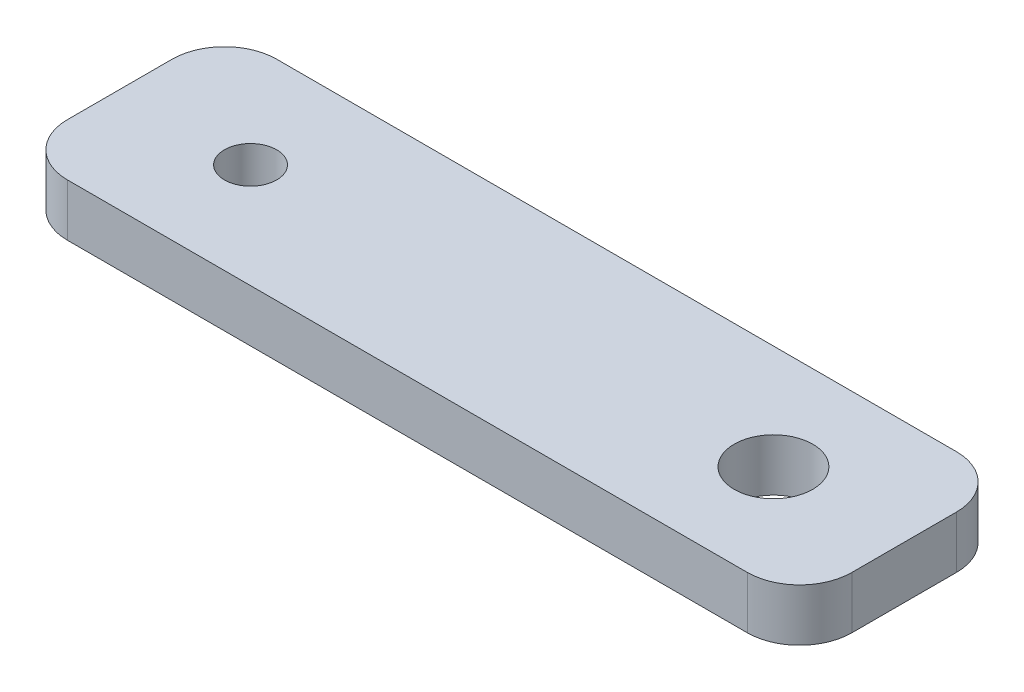
ISO-10303-21;
HEADER;
FILE_DESCRIPTION(('STEP AP214'),'2;1');
FILE_NAME('part.step','',(''),(''),'','','');
FILE_SCHEMA(('AUTOMOTIVE_DESIGN { 1 0 10303 214 1 1 1 1 }'));
ENDSEC;
DATA;
#1=APPLICATION_CONTEXT('core data for automotive mechanical design processes');
#2=APPLICATION_PROTOCOL_DEFINITION('international standard','automotive_design',2000,#1);
#3=PRODUCT_CONTEXT('',#1,'mechanical');
#4=PRODUCT('Part','Part','',(#3));
#5=PRODUCT_RELATED_PRODUCT_CATEGORY('part','',(#4));
#6=PRODUCT_DEFINITION_FORMATION('','',#4);
#7=PRODUCT_DEFINITION_CONTEXT('part definition',#1,'design');
#8=PRODUCT_DEFINITION('design','',#6,#7);
#9=PRODUCT_DEFINITION_SHAPE('','',#8);
#10=(LENGTH_UNIT() NAMED_UNIT(*) SI_UNIT(.MILLI.,.METRE.));
#11=(NAMED_UNIT(*) PLANE_ANGLE_UNIT() SI_UNIT($,.RADIAN.));
#12=(NAMED_UNIT(*) SI_UNIT($,.STERADIAN.) SOLID_ANGLE_UNIT());
#13=UNCERTAINTY_MEASURE_WITH_UNIT(LENGTH_MEASURE(1.E-05),#10,'distance_accuracy_value','');
#14=(GEOMETRIC_REPRESENTATION_CONTEXT(3) GLOBAL_UNCERTAINTY_ASSIGNED_CONTEXT((#13)) GLOBAL_UNIT_ASSIGNED_CONTEXT((#10,
#11,#12)) REPRESENTATION_CONTEXT('',''));
#15=CARTESIAN_POINT('',(0.,0.,0.));
#16=DIRECTION('',(0.,0.,1.));
#17=DIRECTION('',(1.,0.,0.));
#18=AXIS2_PLACEMENT_3D('',#15,#16,#17);
#19=CARTESIAN_POINT('',(0.,2.,0.));
#20=DIRECTION('',(1.,0.,0.));
#21=DIRECTION('',(0.,0.,-1.));
#22=AXIS2_PLACEMENT_3D('',#19,#20,#21);
#23=PLANE('',#22);
#24=DIRECTION('',(0.,0.,1.));
#25=VECTOR('',#24,1.);
#26=CARTESIAN_POINT('',(0.,0.,0.));
#27=LINE('',#26,#25);
#28=CARTESIAN_POINT('',(0.,0.,2.));
#29=VERTEX_POINT('',#28);
#30=CARTESIAN_POINT('',(0.,0.,6.));
#31=VERTEX_POINT('',#30);
#32=EDGE_CURVE('E157',#29,#31,#27,.T.);
#33=ORIENTED_EDGE('',*,*,#32,.T.);
#34=DIRECTION('',(0.,-1.,0.));
#35=VECTOR('',#34,1.);
#36=CARTESIAN_POINT('',(0.,2.,6.));
#37=LINE('',#36,#35);
#38=CARTESIAN_POINT('',(0.,2.,6.));
#39=VERTEX_POINT('',#38);
#40=EDGE_CURVE('E11',#31,#39,#37,.F.);
#41=ORIENTED_EDGE('',*,*,#40,.T.);
#42=DIRECTION('',(0.,0.,1.));
#43=VECTOR('',#42,1.);
#44=CARTESIAN_POINT('',(0.,2.,0.));
#45=LINE('',#44,#43);
#46=CARTESIAN_POINT('',(0.,2.,2.));
#47=VERTEX_POINT('',#46);
#48=EDGE_CURVE('E125',#47,#39,#45,.T.);
#49=ORIENTED_EDGE('',*,*,#48,.F.);
#50=DIRECTION('',(0.,-1.,0.));
#51=VECTOR('',#50,1.);
#52=CARTESIAN_POINT('',(0.,2.,2.));
#53=LINE('',#52,#51);
#54=EDGE_CURVE('E41',#47,#29,#53,.T.);
#55=ORIENTED_EDGE('',*,*,#54,.T.);
#56=EDGE_LOOP('',(#33,#41,#49,#55));
#57=FACE_BOUND('',#56,.T.);
#58=ADVANCED_FACE('F33',(#57),#23,.F.);
#59=CARTESIAN_POINT('',(0.,2.,8.));
#60=DIRECTION('',(0.,0.,-1.));
#61=DIRECTION('',(-1.,0.,0.));
#62=AXIS2_PLACEMENT_3D('',#59,#60,#61);
#63=PLANE('',#62);
#64=DIRECTION('',(1.,0.,0.));
#65=VECTOR('',#64,1.);
#66=CARTESIAN_POINT('',(0.,0.,8.));
#67=LINE('',#66,#65);
#68=CARTESIAN_POINT('',(2.,0.,8.));
#69=VERTEX_POINT('',#68);
#70=CARTESIAN_POINT('',(28.,0.,8.));
#71=VERTEX_POINT('',#70);
#72=EDGE_CURVE('E130',#69,#71,#67,.T.);
#73=ORIENTED_EDGE('',*,*,#72,.T.);
#74=DIRECTION('',(0.,-1.,0.));
#75=VECTOR('',#74,1.);
#76=CARTESIAN_POINT('',(28.,2.,8.));
#77=LINE('',#76,#75);
#78=CARTESIAN_POINT('',(28.,2.,8.));
#79=VERTEX_POINT('',#78);
#80=EDGE_CURVE('E48',#71,#79,#77,.F.);
#81=ORIENTED_EDGE('',*,*,#80,.T.);
#82=DIRECTION('',(1.,0.,0.));
#83=VECTOR('',#82,1.);
#84=CARTESIAN_POINT('',(0.,2.,8.));
#85=LINE('',#84,#83);
#86=CARTESIAN_POINT('',(2.,2.,8.));
#87=VERTEX_POINT('',#86);
#88=EDGE_CURVE('E128',#87,#79,#85,.T.);
#89=ORIENTED_EDGE('',*,*,#88,.F.);
#90=DIRECTION('',(0.,-1.,0.));
#91=VECTOR('',#90,1.);
#92=CARTESIAN_POINT('',(2.,2.,8.));
#93=LINE('',#92,#91);
#94=EDGE_CURVE('E149',#87,#69,#93,.T.);
#95=ORIENTED_EDGE('',*,*,#94,.T.);
#96=EDGE_LOOP('',(#73,#81,#89,#95));
#97=FACE_BOUND('',#96,.T.);
#98=ADVANCED_FACE('F203',(#97),#63,.F.);
#99=CARTESIAN_POINT('',(30.,2.,0.));
#100=DIRECTION('',(-1.,0.,0.));
#101=DIRECTION('',(0.,0.,1.));
#102=AXIS2_PLACEMENT_3D('',#99,#100,#101);
#103=PLANE('',#102);
#104=DIRECTION('',(0.,0.,-1.));
#105=VECTOR('',#104,1.);
#106=CARTESIAN_POINT('',(30.,0.,0.));
#107=LINE('',#106,#105);
#108=CARTESIAN_POINT('',(30.,0.,6.));
#109=VERTEX_POINT('',#108);
#110=CARTESIAN_POINT('',(30.,0.,2.));
#111=VERTEX_POINT('',#110);
#112=EDGE_CURVE('E126',#109,#111,#107,.T.);
#113=ORIENTED_EDGE('',*,*,#112,.T.);
#114=DIRECTION('',(0.,-1.,0.));
#115=VECTOR('',#114,1.);
#116=CARTESIAN_POINT('',(30.,2.,2.));
#117=LINE('',#116,#115);
#118=CARTESIAN_POINT('',(30.,2.,2.));
#119=VERTEX_POINT('',#118);
#120=EDGE_CURVE('E104',#111,#119,#117,.F.);
#121=ORIENTED_EDGE('',*,*,#120,.T.);
#122=DIRECTION('',(0.,0.,-1.));
#123=VECTOR('',#122,1.);
#124=CARTESIAN_POINT('',(30.,2.,0.));
#125=LINE('',#124,#123);
#126=CARTESIAN_POINT('',(30.,2.,6.));
#127=VERTEX_POINT('',#126);
#128=EDGE_CURVE('E169',#127,#119,#125,.T.);
#129=ORIENTED_EDGE('',*,*,#128,.F.);
#130=DIRECTION('',(0.,-1.,0.));
#131=VECTOR('',#130,1.);
#132=CARTESIAN_POINT('',(30.,2.,6.));
#133=LINE('',#132,#131);
#134=EDGE_CURVE('E109',#127,#109,#133,.T.);
#135=ORIENTED_EDGE('',*,*,#134,.T.);
#136=EDGE_LOOP('',(#113,#121,#129,#135));
#137=FACE_BOUND('',#136,.T.);
#138=ADVANCED_FACE('F200',(#137),#103,.F.);
#139=CARTESIAN_POINT('',(0.,2.,0.));
#140=DIRECTION('',(0.,0.,1.));
#141=DIRECTION('',(1.,0.,0.));
#142=AXIS2_PLACEMENT_3D('',#139,#140,#141);
#143=PLANE('',#142);
#144=DIRECTION('',(-1.,0.,0.));
#145=VECTOR('',#144,1.);
#146=CARTESIAN_POINT('',(0.,2.,0.));
#147=LINE('',#146,#145);
#148=CARTESIAN_POINT('',(28.,2.,0.));
#149=VERTEX_POINT('',#148);
#150=CARTESIAN_POINT('',(2.,2.,0.));
#151=VERTEX_POINT('',#150);
#152=EDGE_CURVE('E119',#149,#151,#147,.T.);
#153=ORIENTED_EDGE('',*,*,#152,.F.);
#154=DIRECTION('',(0.,-1.,0.));
#155=VECTOR('',#154,1.);
#156=CARTESIAN_POINT('',(28.,2.,0.));
#157=LINE('',#156,#155);
#158=CARTESIAN_POINT('',(28.,0.,0.));
#159=VERTEX_POINT('',#158);
#160=EDGE_CURVE('E103',#149,#159,#157,.T.);
#161=ORIENTED_EDGE('',*,*,#160,.T.);
#162=DIRECTION('',(-1.,0.,0.));
#163=VECTOR('',#162,1.);
#164=CARTESIAN_POINT('',(0.,0.,0.));
#165=LINE('',#164,#163);
#166=CARTESIAN_POINT('',(2.,0.,0.));
#167=VERTEX_POINT('',#166);
#168=EDGE_CURVE('E116',#159,#167,#165,.T.);
#169=ORIENTED_EDGE('',*,*,#168,.T.);
#170=DIRECTION('',(0.,-1.,0.));
#171=VECTOR('',#170,1.);
#172=CARTESIAN_POINT('',(2.,2.,0.));
#173=LINE('',#172,#171);
#174=EDGE_CURVE('E121',#167,#151,#173,.F.);
#175=ORIENTED_EDGE('',*,*,#174,.T.);
#176=EDGE_LOOP('',(#153,#161,#169,#175));
#177=FACE_BOUND('',#176,.T.);
#178=ADVANCED_FACE('F115',(#177),#143,.F.);
#179=CARTESIAN_POINT('',(0.,2.,0.));
#180=DIRECTION('',(0.,1.,0.));
#181=DIRECTION('',(0.,0.,1.));
#182=AXIS2_PLACEMENT_3D('',#179,#180,#181);
#183=PLANE('',#182);
#184=CARTESIAN_POINT('',(5.,2.,4.));
#185=DIRECTION('',(0.,1.,0.));
#186=DIRECTION('',(0.,0.,1.));
#187=AXIS2_PLACEMENT_3D('',#184,#185,#186);
#188=CIRCLE('',#187,1.);
#189=CARTESIAN_POINT('',(5.,2.,5.));
#190=VERTEX_POINT('',#189);
#191=EDGE_CURVE('E176',#190,#190,#188,.T.);
#192=ORIENTED_EDGE('',*,*,#191,.F.);
#193=EDGE_LOOP('',(#192));
#194=FACE_BOUND('',#193,.T.);
#195=CARTESIAN_POINT('',(25.,2.,4.));
#196=DIRECTION('',(0.,1.,0.));
#197=DIRECTION('',(0.,0.,1.));
#198=AXIS2_PLACEMENT_3D('',#195,#196,#197);
#199=CIRCLE('',#198,1.50000000000001);
#200=CARTESIAN_POINT('',(25.,2.,5.50000000000001));
#201=VERTEX_POINT('',#200);
#202=EDGE_CURVE('E165',#201,#201,#199,.T.);
#203=ORIENTED_EDGE('',*,*,#202,.F.);
#204=EDGE_LOOP('',(#203));
#205=FACE_BOUND('',#204,.T.);
#206=ORIENTED_EDGE('',*,*,#128,.T.);
#207=CARTESIAN_POINT('',(28.,2.,2.));
#208=DIRECTION('',(0.,1.,0.));
#209=DIRECTION('',(0.,0.,1.));
#210=AXIS2_PLACEMENT_3D('',#207,#208,#209);
#211=CIRCLE('',#210,2.);
#212=EDGE_CURVE('E147',#119,#149,#211,.T.);
#213=ORIENTED_EDGE('',*,*,#212,.T.);
#214=ORIENTED_EDGE('',*,*,#152,.T.);
#215=CARTESIAN_POINT('',(2.,2.,2.));
#216=DIRECTION('',(0.,1.,0.));
#217=DIRECTION('',(0.,0.,1.));
#218=AXIS2_PLACEMENT_3D('',#215,#216,#217);
#219=CIRCLE('',#218,2.);
#220=EDGE_CURVE('E142',#151,#47,#219,.T.);
#221=ORIENTED_EDGE('',*,*,#220,.T.);
#222=ORIENTED_EDGE('',*,*,#48,.T.);
#223=CARTESIAN_POINT('',(2.,2.,6.));
#224=DIRECTION('',(0.,1.,0.));
#225=DIRECTION('',(0.,0.,1.));
#226=AXIS2_PLACEMENT_3D('',#223,#224,#225);
#227=CIRCLE('',#226,2.);
#228=EDGE_CURVE('E55',#39,#87,#227,.T.);
#229=ORIENTED_EDGE('',*,*,#228,.T.);
#230=ORIENTED_EDGE('',*,*,#88,.T.);
#231=CARTESIAN_POINT('',(28.,2.,6.));
#232=DIRECTION('',(0.,1.,0.));
#233=DIRECTION('',(0.,0.,1.));
#234=AXIS2_PLACEMENT_3D('',#231,#232,#233);
#235=CIRCLE('',#234,2.);
#236=EDGE_CURVE('E145',#79,#127,#235,.T.);
#237=ORIENTED_EDGE('',*,*,#236,.T.);
#238=EDGE_LOOP('',(#206,#213,#214,#221,#222,#229,#230,#237));
#239=FACE_BOUND('',#238,.T.);
#240=ADVANCED_FACE('F191',(#194,#205,#239),#183,.T.);
#241=CARTESIAN_POINT('',(0.,0.,0.));
#242=DIRECTION('',(0.,1.,0.));
#243=DIRECTION('',(0.,0.,1.));
#244=AXIS2_PLACEMENT_3D('',#241,#242,#243);
#245=PLANE('',#244);
#246=CARTESIAN_POINT('',(5.,0.,4.));
#247=DIRECTION('',(0.,1.,0.));
#248=DIRECTION('',(0.,0.,1.));
#249=AXIS2_PLACEMENT_3D('',#246,#247,#248);
#250=CIRCLE('',#249,1.);
#251=CARTESIAN_POINT('',(5.,0.,5.));
#252=VERTEX_POINT('',#251);
#253=EDGE_CURVE('E174',#252,#252,#250,.T.);
#254=ORIENTED_EDGE('',*,*,#253,.T.);
#255=EDGE_LOOP('',(#254));
#256=FACE_BOUND('',#255,.T.);
#257=CARTESIAN_POINT('',(25.,0.,4.));
#258=DIRECTION('',(0.,1.,0.));
#259=DIRECTION('',(0.,0.,1.));
#260=AXIS2_PLACEMENT_3D('',#257,#258,#259);
#261=CIRCLE('',#260,1.50000000000001);
#262=CARTESIAN_POINT('',(25.,0.,5.50000000000001));
#263=VERTEX_POINT('',#262);
#264=EDGE_CURVE('E162',#263,#263,#261,.T.);
#265=ORIENTED_EDGE('',*,*,#264,.T.);
#266=EDGE_LOOP('',(#265));
#267=FACE_BOUND('',#266,.T.);
#268=ORIENTED_EDGE('',*,*,#168,.F.);
#269=CARTESIAN_POINT('',(28.,0.,2.));
#270=DIRECTION('',(0.,1.,0.));
#271=DIRECTION('',(0.,0.,1.));
#272=AXIS2_PLACEMENT_3D('',#269,#270,#271);
#273=CIRCLE('',#272,2.);
#274=EDGE_CURVE('E99',#159,#111,#273,.F.);
#275=ORIENTED_EDGE('',*,*,#274,.T.);
#276=ORIENTED_EDGE('',*,*,#112,.F.);
#277=CARTESIAN_POINT('',(28.,0.,6.));
#278=DIRECTION('',(0.,1.,0.));
#279=DIRECTION('',(0.,0.,1.));
#280=AXIS2_PLACEMENT_3D('',#277,#278,#279);
#281=CIRCLE('',#280,2.);
#282=EDGE_CURVE('E110',#109,#71,#281,.F.);
#283=ORIENTED_EDGE('',*,*,#282,.T.);
#284=ORIENTED_EDGE('',*,*,#72,.F.);
#285=CARTESIAN_POINT('',(2.,0.,6.));
#286=DIRECTION('',(0.,1.,0.));
#287=DIRECTION('',(0.,0.,1.));
#288=AXIS2_PLACEMENT_3D('',#285,#286,#287);
#289=CIRCLE('',#288,2.);
#290=EDGE_CURVE('E136',#69,#31,#289,.F.);
#291=ORIENTED_EDGE('',*,*,#290,.T.);
#292=ORIENTED_EDGE('',*,*,#32,.F.);
#293=CARTESIAN_POINT('',(2.,0.,2.));
#294=DIRECTION('',(0.,1.,0.));
#295=DIRECTION('',(0.,0.,1.));
#296=AXIS2_PLACEMENT_3D('',#293,#294,#295);
#297=CIRCLE('',#296,2.);
#298=EDGE_CURVE('E120',#29,#167,#297,.F.);
#299=ORIENTED_EDGE('',*,*,#298,.T.);
#300=EDGE_LOOP('',(#268,#275,#276,#283,#284,#291,#292,#299));
#301=FACE_BOUND('',#300,.T.);
#302=ADVANCED_FACE('F123',(#256,#267,#301),#245,.F.);
#303=CARTESIAN_POINT('',(25.,0.,4.));
#304=DIRECTION('',(0.,1.,0.));
#305=DIRECTION('',(0.,0.,1.));
#306=AXIS2_PLACEMENT_3D('',#303,#304,#305);
#307=CYLINDRICAL_SURFACE('',#306,1.50000000000001);
#308=ORIENTED_EDGE('',*,*,#264,.F.);
#309=EDGE_LOOP('',(#308));
#310=FACE_BOUND('',#309,.T.);
#311=ORIENTED_EDGE('',*,*,#202,.T.);
#312=EDGE_LOOP('',(#311));
#313=FACE_BOUND('',#312,.T.);
#314=ADVANCED_FACE('F187',(#310,#313),#307,.F.);
#315=CARTESIAN_POINT('',(5.,0.,4.));
#316=DIRECTION('',(0.,1.,0.));
#317=DIRECTION('',(0.,0.,1.));
#318=AXIS2_PLACEMENT_3D('',#315,#316,#317);
#319=CYLINDRICAL_SURFACE('',#318,1.);
#320=ORIENTED_EDGE('',*,*,#253,.F.);
#321=EDGE_LOOP('',(#320));
#322=FACE_BOUND('',#321,.T.);
#323=ORIENTED_EDGE('',*,*,#191,.T.);
#324=EDGE_LOOP('',(#323));
#325=FACE_BOUND('',#324,.T.);
#326=ADVANCED_FACE('F184',(#322,#325),#319,.F.);
#327=CARTESIAN_POINT('',(28.,2.,2.));
#328=DIRECTION('',(0.,-1.,0.));
#329=DIRECTION('',(0.,0.,-1.));
#330=AXIS2_PLACEMENT_3D('',#327,#328,#329);
#331=CYLINDRICAL_SURFACE('',#330,2.);
#332=ORIENTED_EDGE('',*,*,#212,.F.);
#333=ORIENTED_EDGE('',*,*,#120,.F.);
#334=ORIENTED_EDGE('',*,*,#274,.F.);
#335=ORIENTED_EDGE('',*,*,#160,.F.);
#336=EDGE_LOOP('',(#332,#333,#334,#335));
#337=FACE_BOUND('',#336,.T.);
#338=ADVANCED_FACE('F102',(#337),#331,.T.);
#339=CARTESIAN_POINT('',(28.,2.,6.));
#340=DIRECTION('',(0.,-1.,0.));
#341=DIRECTION('',(0.,0.,-1.));
#342=AXIS2_PLACEMENT_3D('',#339,#340,#341);
#343=CYLINDRICAL_SURFACE('',#342,2.);
#344=ORIENTED_EDGE('',*,*,#236,.F.);
#345=ORIENTED_EDGE('',*,*,#80,.F.);
#346=ORIENTED_EDGE('',*,*,#282,.F.);
#347=ORIENTED_EDGE('',*,*,#134,.F.);
#348=EDGE_LOOP('',(#344,#345,#346,#347));
#349=FACE_BOUND('',#348,.T.);
#350=ADVANCED_FACE('F202',(#349),#343,.T.);
#351=CARTESIAN_POINT('',(2.,2.,6.));
#352=DIRECTION('',(0.,-1.,0.));
#353=DIRECTION('',(0.,0.,-1.));
#354=AXIS2_PLACEMENT_3D('',#351,#352,#353);
#355=CYLINDRICAL_SURFACE('',#354,2.);
#356=ORIENTED_EDGE('',*,*,#228,.F.);
#357=ORIENTED_EDGE('',*,*,#40,.F.);
#358=ORIENTED_EDGE('',*,*,#290,.F.);
#359=ORIENTED_EDGE('',*,*,#94,.F.);
#360=EDGE_LOOP('',(#356,#357,#358,#359));
#361=FACE_BOUND('',#360,.T.);
#362=ADVANCED_FACE('F206',(#361),#355,.T.);
#363=CARTESIAN_POINT('',(2.,2.,2.));
#364=DIRECTION('',(0.,-1.,0.));
#365=DIRECTION('',(0.,0.,-1.));
#366=AXIS2_PLACEMENT_3D('',#363,#364,#365);
#367=CYLINDRICAL_SURFACE('',#366,2.);
#368=ORIENTED_EDGE('',*,*,#220,.F.);
#369=ORIENTED_EDGE('',*,*,#174,.F.);
#370=ORIENTED_EDGE('',*,*,#298,.F.);
#371=ORIENTED_EDGE('',*,*,#54,.F.);
#372=EDGE_LOOP('',(#368,#369,#370,#371));
#373=FACE_BOUND('',#372,.T.);
#374=ADVANCED_FACE('F35',(#373),#367,.T.);
#375=CLOSED_SHELL('',(#58,#98,#138,#178,#240,#302,#314,#326,#338,#350,#362,#374));
#376=MANIFOLD_SOLID_BREP('B2',#375);
#377=ADVANCED_BREP_SHAPE_REPRESENTATION('',(#18,#376),#14);
#378=SHAPE_DEFINITION_REPRESENTATION(#9,#377);
ENDSEC;
END-ISO-10303-21;
